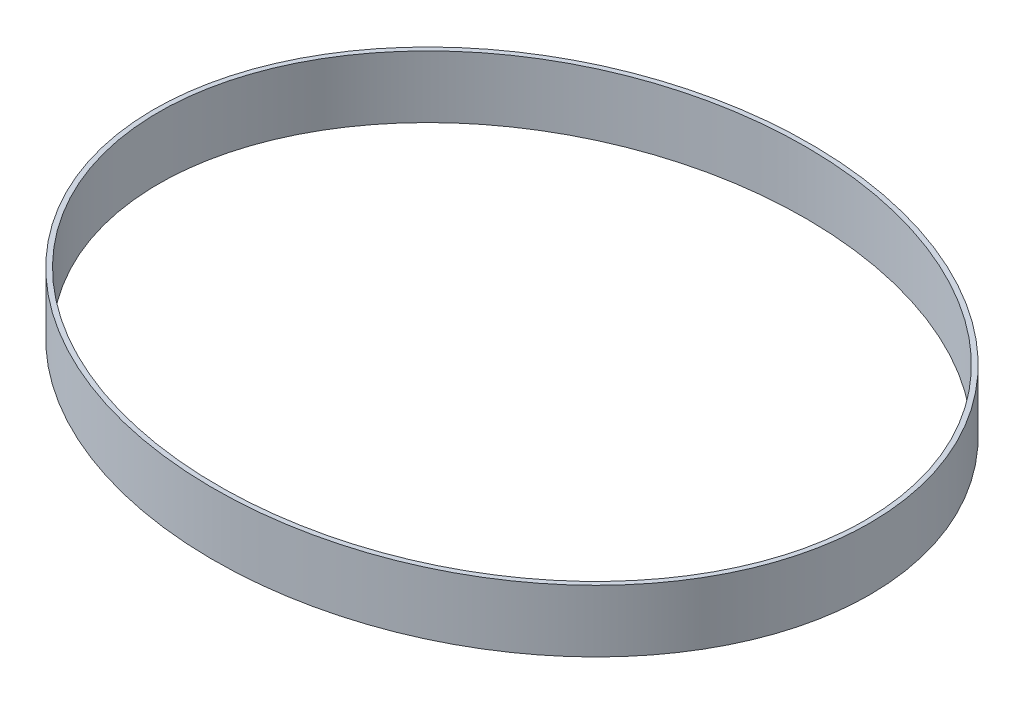
ISO-10303-21;
HEADER;
FILE_DESCRIPTION(('STEP AP214'),'2;1');
FILE_NAME('part.step','',(''),(''),'','','');
FILE_SCHEMA(('AUTOMOTIVE_DESIGN { 1 0 10303 214 1 1 1 1 }'));
ENDSEC;
DATA;
#1=APPLICATION_CONTEXT('core data for automotive mechanical design processes');
#2=APPLICATION_PROTOCOL_DEFINITION('international standard','automotive_design',2000,#1);
#3=PRODUCT_CONTEXT('',#1,'mechanical');
#4=PRODUCT('Part','Part','',(#3));
#5=PRODUCT_RELATED_PRODUCT_CATEGORY('part','',(#4));
#6=PRODUCT_DEFINITION_FORMATION('','',#4);
#7=PRODUCT_DEFINITION_CONTEXT('part definition',#1,'design');
#8=PRODUCT_DEFINITION('design','',#6,#7);
#9=PRODUCT_DEFINITION_SHAPE('','',#8);
#10=(LENGTH_UNIT() NAMED_UNIT(*) SI_UNIT(.MILLI.,.METRE.));
#11=(NAMED_UNIT(*) PLANE_ANGLE_UNIT() SI_UNIT($,.RADIAN.));
#12=(NAMED_UNIT(*) SI_UNIT($,.STERADIAN.) SOLID_ANGLE_UNIT());
#13=UNCERTAINTY_MEASURE_WITH_UNIT(LENGTH_MEASURE(1.E-05),#10,'distance_accuracy_value','');
#14=(GEOMETRIC_REPRESENTATION_CONTEXT(3) GLOBAL_UNCERTAINTY_ASSIGNED_CONTEXT((#13)) GLOBAL_UNIT_ASSIGNED_CONTEXT((#10,
#11,#12)) REPRESENTATION_CONTEXT('',''));
#15=CARTESIAN_POINT('',(0.,0.,0.));
#16=DIRECTION('',(0.,0.,1.));
#17=DIRECTION('',(1.,0.,0.));
#18=AXIS2_PLACEMENT_3D('',#15,#16,#17);
#19=CARTESIAN_POINT('',(0.,13.,0.));
#20=DIRECTION('',(0.,1.,0.));
#21=DIRECTION('',(0.,0.,1.));
#22=AXIS2_PLACEMENT_3D('',#19,#20,#21);
#23=PLANE('',#22);
#24=CARTESIAN_POINT('',(0.,13.,0.));
#25=DIRECTION('',(0.,1.,0.));
#26=DIRECTION('',(1.,0.,0.));
#27=AXIS2_PLACEMENT_3D('',#24,#25,#26);
#28=ELLIPSE('',#27,75.,62.5);
#29=CARTESIAN_POINT('',(75.,13.,0.));
#30=VERTEX_POINT('',#29);
#31=EDGE_CURVE('E10',#30,#30,#28,.T.);
#32=ORIENTED_EDGE('',*,*,#31,.T.);
#33=EDGE_LOOP('',(#32));
#34=FACE_BOUND('',#33,.T.);
#35=CARTESIAN_POINT('',(0.,13.,0.));
#36=DIRECTION('',(0.,1.,0.));
#37=DIRECTION('',(1.,0.,0.));
#38=AXIS2_PLACEMENT_3D('',#35,#36,#37);
#39=ELLIPSE('',#38,74.,61.5);
#40=CARTESIAN_POINT('',(74.,13.,0.));
#41=VERTEX_POINT('',#40);
#42=EDGE_CURVE('E50',#41,#41,#39,.T.);
#43=ORIENTED_EDGE('',*,*,#42,.F.);
#44=EDGE_LOOP('',(#43));
#45=FACE_BOUND('',#44,.T.);
#46=ADVANCED_FACE('F37',(#34,#45),#23,.T.);
#47=CARTESIAN_POINT('',(0.,0.,0.));
#48=DIRECTION('',(0.,1.,0.));
#49=DIRECTION('',(0.,0.,1.));
#50=AXIS2_PLACEMENT_3D('',#47,#48,#49);
#51=PLANE('',#50);
#52=CARTESIAN_POINT('',(0.,0.,0.));
#53=DIRECTION('',(0.,1.,0.));
#54=DIRECTION('',(1.,0.,0.));
#55=AXIS2_PLACEMENT_3D('',#52,#53,#54);
#56=ELLIPSE('',#55,75.,62.5);
#57=CARTESIAN_POINT('',(75.,0.,0.));
#58=VERTEX_POINT('',#57);
#59=EDGE_CURVE('E42',#58,#58,#56,.T.);
#60=ORIENTED_EDGE('',*,*,#59,.F.);
#61=EDGE_LOOP('',(#60));
#62=FACE_BOUND('',#61,.T.);
#63=CARTESIAN_POINT('',(0.,0.,0.));
#64=DIRECTION('',(0.,1.,0.));
#65=DIRECTION('',(1.,0.,0.));
#66=AXIS2_PLACEMENT_3D('',#63,#64,#65);
#67=ELLIPSE('',#66,74.,61.5);
#68=CARTESIAN_POINT('',(74.,0.,0.));
#69=VERTEX_POINT('',#68);
#70=EDGE_CURVE('E53',#69,#69,#67,.T.);
#71=ORIENTED_EDGE('',*,*,#70,.T.);
#72=EDGE_LOOP('',(#71));
#73=FACE_BOUND('',#72,.T.);
#74=ADVANCED_FACE('F66',(#62,#73),#51,.F.);
#75=DIRECTION('',(0.,-1.,0.));
#76=VECTOR('',#75,1.);
#77=SURFACE_OF_LINEAR_EXTRUSION('',#28,#76);
#78=ORIENTED_EDGE('',*,*,#31,.F.);
#79=EDGE_LOOP('',(#78));
#80=FACE_BOUND('',#79,.T.);
#81=ORIENTED_EDGE('',*,*,#59,.T.);
#82=EDGE_LOOP('',(#81));
#83=FACE_BOUND('',#82,.T.);
#84=ADVANCED_FACE('F39',(#80,#83),#77,.F.);
#85=DIRECTION('',(0.,-1.,0.));
#86=VECTOR('',#85,1.);
#87=SURFACE_OF_LINEAR_EXTRUSION('',#39,#86);
#88=ORIENTED_EDGE('',*,*,#42,.T.);
#89=EDGE_LOOP('',(#88));
#90=FACE_BOUND('',#89,.T.);
#91=ORIENTED_EDGE('',*,*,#70,.F.);
#92=EDGE_LOOP('',(#91));
#93=FACE_BOUND('',#92,.T.);
#94=ADVANCED_FACE('F61',(#90,#93),#87,.T.);
#95=CLOSED_SHELL('',(#46,#74,#84,#94));
#96=MANIFOLD_SOLID_BREP('B2',#95);
#97=ADVANCED_BREP_SHAPE_REPRESENTATION('',(#18,#96),#14);
#98=SHAPE_DEFINITION_REPRESENTATION(#9,#97);
ENDSEC;
END-ISO-10303-21;
